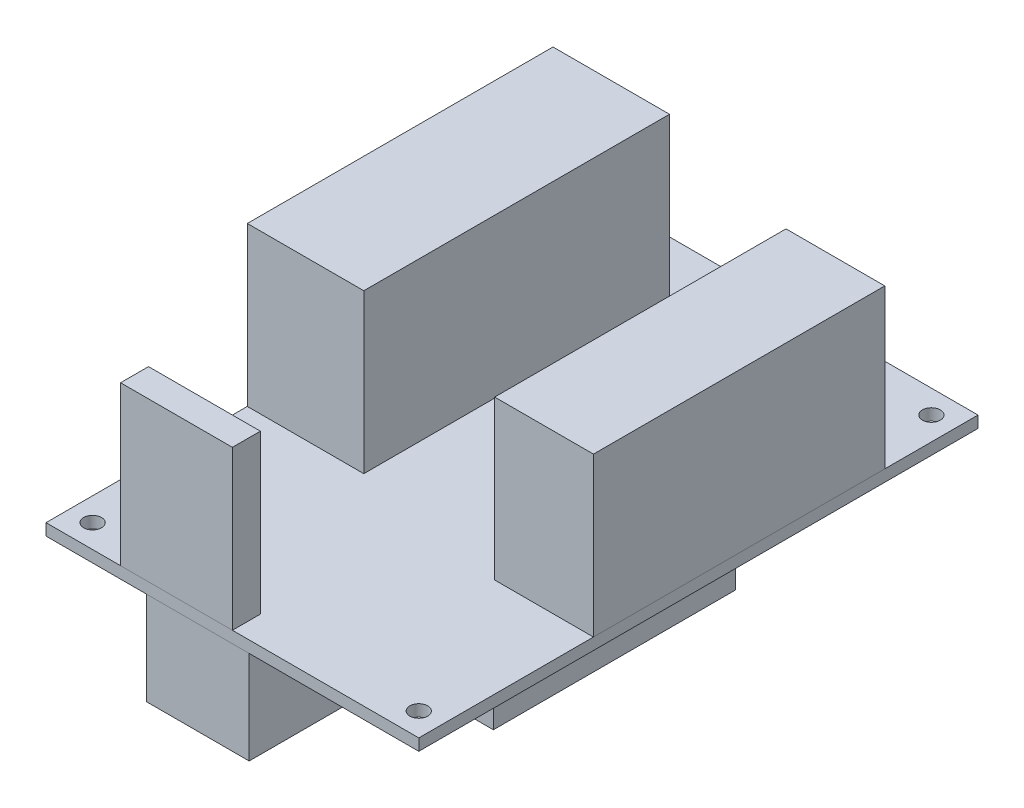
ISO-10303-21;
HEADER;
FILE_DESCRIPTION(('STEP AP214'),'2;1');
FILE_NAME('part.step','',(''),(''),'','','');
FILE_SCHEMA(('AUTOMOTIVE_DESIGN { 1 0 10303 214 1 1 1 1 }'));
ENDSEC;
DATA;
#1=APPLICATION_CONTEXT('core data for automotive mechanical design processes');
#2=APPLICATION_PROTOCOL_DEFINITION('international standard','automotive_design',2000,#1);
#3=PRODUCT_CONTEXT('',#1,'mechanical');
#4=PRODUCT('Part','Part','',(#3));
#5=PRODUCT_RELATED_PRODUCT_CATEGORY('part','',(#4));
#6=PRODUCT_DEFINITION_FORMATION('','',#4);
#7=PRODUCT_DEFINITION_CONTEXT('part definition',#1,'design');
#8=PRODUCT_DEFINITION('design','',#6,#7);
#9=PRODUCT_DEFINITION_SHAPE('','',#8);
#10=(LENGTH_UNIT() NAMED_UNIT(*) SI_UNIT(.MILLI.,.METRE.));
#11=(NAMED_UNIT(*) PLANE_ANGLE_UNIT() SI_UNIT($,.RADIAN.));
#12=(NAMED_UNIT(*) SI_UNIT($,.STERADIAN.) SOLID_ANGLE_UNIT());
#13=UNCERTAINTY_MEASURE_WITH_UNIT(LENGTH_MEASURE(1.E-05),#10,'distance_accuracy_value','');
#14=(GEOMETRIC_REPRESENTATION_CONTEXT(3) GLOBAL_UNCERTAINTY_ASSIGNED_CONTEXT((#13)) GLOBAL_UNIT_ASSIGNED_CONTEXT((#10,
#11,#12)) REPRESENTATION_CONTEXT('',''));
#15=CARTESIAN_POINT('',(0.,0.,0.));
#16=DIRECTION('',(0.,0.,1.));
#17=DIRECTION('',(1.,0.,0.));
#18=AXIS2_PLACEMENT_3D('',#15,#16,#17);
#19=CARTESIAN_POINT('',(2.54,-12.7,17.78));
#20=DIRECTION('',(1.,0.,0.));
#21=DIRECTION('',(0.,0.,-1.));
#22=AXIS2_PLACEMENT_3D('',#19,#20,#21);
#23=PLANE('',#22);
#24=DIRECTION('',(0.,0.,-1.));
#25=VECTOR('',#24,1.);
#26=CARTESIAN_POINT('',(2.54,0.,17.78));
#27=LINE('',#26,#25);
#28=CARTESIAN_POINT('',(2.54,0.,17.78));
#29=VERTEX_POINT('',#28);
#30=CARTESIAN_POINT('',(2.54000000000001,0.,-15.24));
#31=VERTEX_POINT('',#30);
#32=EDGE_CURVE('E109',#29,#31,#27,.T.);
#33=ORIENTED_EDGE('',*,*,#32,.T.);
#34=DIRECTION('',(0.,1.,0.));
#35=VECTOR('',#34,1.);
#36=CARTESIAN_POINT('',(2.54000000000001,-12.7,-15.24));
#37=LINE('',#36,#35);
#38=CARTESIAN_POINT('',(2.54000000000001,-12.7,-15.24));
#39=VERTEX_POINT('',#38);
#40=EDGE_CURVE('E12',#39,#31,#37,.T.);
#41=ORIENTED_EDGE('',*,*,#40,.F.);
#42=DIRECTION('',(0.,0.,-1.));
#43=VECTOR('',#42,1.);
#44=CARTESIAN_POINT('',(2.54,-12.7,17.78));
#45=LINE('',#44,#43);
#46=CARTESIAN_POINT('',(2.54,-12.7,17.78));
#47=VERTEX_POINT('',#46);
#48=EDGE_CURVE('E97',#47,#39,#45,.T.);
#49=ORIENTED_EDGE('',*,*,#48,.F.);
#50=DIRECTION('',(0.,1.,0.));
#51=VECTOR('',#50,1.);
#52=CARTESIAN_POINT('',(2.54,-12.7,17.78));
#53=LINE('',#52,#51);
#54=EDGE_CURVE('E105',#47,#29,#53,.T.);
#55=ORIENTED_EDGE('',*,*,#54,.T.);
#56=EDGE_LOOP('',(#33,#41,#49,#55));
#57=FACE_BOUND('',#56,.T.);
#58=ADVANCED_FACE('F46',(#57),#23,.F.);
#59=CARTESIAN_POINT('',(2.54000000000001,-12.7,-15.24));
#60=DIRECTION('',(0.,0.,1.));
#61=DIRECTION('',(1.,0.,0.));
#62=AXIS2_PLACEMENT_3D('',#59,#60,#61);
#63=PLANE('',#62);
#64=DIRECTION('',(1.,0.,0.));
#65=VECTOR('',#64,1.);
#66=CARTESIAN_POINT('',(2.54000000000001,0.,-15.24));
#67=LINE('',#66,#65);
#68=CARTESIAN_POINT('',(15.24,0.,-15.24));
#69=VERTEX_POINT('',#68);
#70=EDGE_CURVE('E101',#31,#69,#67,.T.);
#71=ORIENTED_EDGE('',*,*,#70,.T.);
#72=DIRECTION('',(0.,1.,0.));
#73=VECTOR('',#72,1.);
#74=CARTESIAN_POINT('',(15.24,-12.7,-15.24));
#75=LINE('',#74,#73);
#76=CARTESIAN_POINT('',(15.24,-12.7,-15.24));
#77=VERTEX_POINT('',#76);
#78=EDGE_CURVE('E54',#77,#69,#75,.T.);
#79=ORIENTED_EDGE('',*,*,#78,.F.);
#80=DIRECTION('',(1.,0.,0.));
#81=VECTOR('',#80,1.);
#82=CARTESIAN_POINT('',(2.54000000000001,-12.7,-15.24));
#83=LINE('',#82,#81);
#84=EDGE_CURVE('E92',#39,#77,#83,.T.);
#85=ORIENTED_EDGE('',*,*,#84,.F.);
#86=ORIENTED_EDGE('',*,*,#40,.T.);
#87=EDGE_LOOP('',(#71,#79,#85,#86));
#88=FACE_BOUND('',#87,.T.);
#89=ADVANCED_FACE('F100',(#88),#63,.F.);
#90=CARTESIAN_POINT('',(15.24,-12.7,17.78));
#91=DIRECTION('',(-1.,0.,0.));
#92=DIRECTION('',(0.,0.,1.));
#93=AXIS2_PLACEMENT_3D('',#90,#91,#92);
#94=PLANE('',#93);
#95=DIRECTION('',(0.,0.,1.));
#96=VECTOR('',#95,1.);
#97=CARTESIAN_POINT('',(15.24,0.,17.78));
#98=LINE('',#97,#96);
#99=CARTESIAN_POINT('',(15.24,0.,17.78));
#100=VERTEX_POINT('',#99);
#101=EDGE_CURVE('E79',#69,#100,#98,.T.);
#102=ORIENTED_EDGE('',*,*,#101,.T.);
#103=DIRECTION('',(0.,1.,0.));
#104=VECTOR('',#103,1.);
#105=CARTESIAN_POINT('',(15.24,-12.7,17.78));
#106=LINE('',#105,#104);
#107=CARTESIAN_POINT('',(15.24,-12.7,17.78));
#108=VERTEX_POINT('',#107);
#109=EDGE_CURVE('E102',#108,#100,#106,.T.);
#110=ORIENTED_EDGE('',*,*,#109,.F.);
#111=DIRECTION('',(0.,0.,1.));
#112=VECTOR('',#111,1.);
#113=CARTESIAN_POINT('',(15.24,-12.7,17.78));
#114=LINE('',#113,#112);
#115=EDGE_CURVE('E95',#77,#108,#114,.T.);
#116=ORIENTED_EDGE('',*,*,#115,.F.);
#117=ORIENTED_EDGE('',*,*,#78,.T.);
#118=EDGE_LOOP('',(#102,#110,#116,#117));
#119=FACE_BOUND('',#118,.T.);
#120=ADVANCED_FACE('F103',(#119),#94,.F.);
#121=CARTESIAN_POINT('',(2.54,-12.7,17.78));
#122=DIRECTION('',(0.,0.,-1.));
#123=DIRECTION('',(-1.,0.,0.));
#124=AXIS2_PLACEMENT_3D('',#121,#122,#123);
#125=PLANE('',#124);
#126=DIRECTION('',(-1.,0.,0.));
#127=VECTOR('',#126,1.);
#128=CARTESIAN_POINT('',(2.54,0.,17.78));
#129=LINE('',#128,#127);
#130=EDGE_CURVE('E85',#100,#29,#129,.T.);
#131=ORIENTED_EDGE('',*,*,#130,.T.);
#132=ORIENTED_EDGE('',*,*,#54,.F.);
#133=DIRECTION('',(-1.,0.,0.));
#134=VECTOR('',#133,1.);
#135=CARTESIAN_POINT('',(2.54,-12.7,17.78));
#136=LINE('',#135,#134);
#137=EDGE_CURVE('E62',#108,#47,#136,.T.);
#138=ORIENTED_EDGE('',*,*,#137,.F.);
#139=ORIENTED_EDGE('',*,*,#109,.T.);
#140=EDGE_LOOP('',(#131,#132,#138,#139));
#141=FACE_BOUND('',#140,.T.);
#142=ADVANCED_FACE('F116',(#141),#125,.F.);
#143=CARTESIAN_POINT('',(0.,-12.7,0.));
#144=DIRECTION('',(0.,-1.,0.));
#145=DIRECTION('',(0.,0.,-1.));
#146=AXIS2_PLACEMENT_3D('',#143,#144,#145);
#147=PLANE('',#146);
#148=ORIENTED_EDGE('',*,*,#48,.T.);
#149=ORIENTED_EDGE('',*,*,#84,.T.);
#150=ORIENTED_EDGE('',*,*,#115,.T.);
#151=ORIENTED_EDGE('',*,*,#137,.T.);
#152=EDGE_LOOP('',(#148,#149,#150,#151));
#153=FACE_BOUND('',#152,.T.);
#154=ADVANCED_FACE('F93',(#153),#147,.T.);
#155=CARTESIAN_POINT('',(0.,0.,0.));
#156=DIRECTION('',(0.,-1.,0.));
#157=DIRECTION('',(0.,0.,-1.));
#158=AXIS2_PLACEMENT_3D('',#155,#156,#157);
#159=PLANE('',#158);
#160=ORIENTED_EDGE('',*,*,#32,.F.);
#161=ORIENTED_EDGE('',*,*,#130,.F.);
#162=ORIENTED_EDGE('',*,*,#101,.F.);
#163=ORIENTED_EDGE('',*,*,#70,.F.);
#164=EDGE_LOOP('',(#160,#161,#162,#163));
#165=FACE_BOUND('',#164,.T.);
#166=ADVANCED_FACE('F119',(#165),#159,.F.);
#167=CLOSED_SHELL('',(#58,#89,#120,#142,#154,#166));
#168=MANIFOLD_SOLID_BREP('B2',#167);
#169=CARTESIAN_POINT('',(-11.684,-12.7,38.1));
#170=DIRECTION('',(1.,0.,0.));
#171=DIRECTION('',(0.,0.,-1.));
#172=AXIS2_PLACEMENT_3D('',#169,#170,#171);
#173=PLANE('',#172);
#174=DIRECTION('',(0.,0.,-1.));
#175=VECTOR('',#174,1.);
#176=CARTESIAN_POINT('',(-11.684,0.,38.1));
#177=LINE('',#176,#175);
#178=CARTESIAN_POINT('',(-11.684,0.,38.1));
#179=VERTEX_POINT('',#178);
#180=CARTESIAN_POINT('',(-11.684,0.,-22.098));
#181=VERTEX_POINT('',#180);
#182=EDGE_CURVE('E243',#179,#181,#177,.T.);
#183=ORIENTED_EDGE('',*,*,#182,.T.);
#184=DIRECTION('',(0.,1.,0.));
#185=VECTOR('',#184,1.);
#186=CARTESIAN_POINT('',(-11.684,-12.7,-22.098));
#187=LINE('',#186,#185);
#188=CARTESIAN_POINT('',(-11.684,-12.7,-22.098));
#189=VERTEX_POINT('',#188);
#190=EDGE_CURVE('E44',#189,#181,#187,.T.);
#191=ORIENTED_EDGE('',*,*,#190,.F.);
#192=DIRECTION('',(0.,0.,-1.));
#193=VECTOR('',#192,1.);
#194=CARTESIAN_POINT('',(-11.684,-12.7,38.1));
#195=LINE('',#194,#193);
#196=CARTESIAN_POINT('',(-11.684,-12.7,38.1));
#197=VERTEX_POINT('',#196);
#198=EDGE_CURVE('E231',#197,#189,#195,.T.);
#199=ORIENTED_EDGE('',*,*,#198,.F.);
#200=DIRECTION('',(0.,1.,0.));
#201=VECTOR('',#200,1.);
#202=CARTESIAN_POINT('',(-11.684,-12.7,38.1));
#203=LINE('',#202,#201);
#204=EDGE_CURVE('E239',#197,#179,#203,.T.);
#205=ORIENTED_EDGE('',*,*,#204,.T.);
#206=EDGE_LOOP('',(#183,#191,#199,#205));
#207=FACE_BOUND('',#206,.T.);
#208=ADVANCED_FACE('F180',(#207),#173,.F.);
#209=CARTESIAN_POINT('',(-11.684,-12.7,-22.098));
#210=DIRECTION('',(0.,0.,1.));
#211=DIRECTION('',(1.,0.,0.));
#212=AXIS2_PLACEMENT_3D('',#209,#210,#211);
#213=PLANE('',#212);
#214=DIRECTION('',(1.,0.,0.));
#215=VECTOR('',#214,1.);
#216=CARTESIAN_POINT('',(-11.684,0.,-22.098));
#217=LINE('',#216,#215);
#218=CARTESIAN_POINT('',(2.28600000000001,0.,-22.098));
#219=VERTEX_POINT('',#218);
#220=EDGE_CURVE('E235',#181,#219,#217,.T.);
#221=ORIENTED_EDGE('',*,*,#220,.T.);
#222=DIRECTION('',(0.,1.,0.));
#223=VECTOR('',#222,1.);
#224=CARTESIAN_POINT('',(2.28600000000001,-12.7,-22.098));
#225=LINE('',#224,#223);
#226=CARTESIAN_POINT('',(2.28600000000001,-12.7,-22.098));
#227=VERTEX_POINT('',#226);
#228=EDGE_CURVE('E188',#227,#219,#225,.T.);
#229=ORIENTED_EDGE('',*,*,#228,.F.);
#230=DIRECTION('',(1.,0.,0.));
#231=VECTOR('',#230,1.);
#232=CARTESIAN_POINT('',(-11.684,-12.7,-22.098));
#233=LINE('',#232,#231);
#234=EDGE_CURVE('E226',#189,#227,#233,.T.);
#235=ORIENTED_EDGE('',*,*,#234,.F.);
#236=ORIENTED_EDGE('',*,*,#190,.T.);
#237=EDGE_LOOP('',(#221,#229,#235,#236));
#238=FACE_BOUND('',#237,.T.);
#239=ADVANCED_FACE('F234',(#238),#213,.F.);
#240=CARTESIAN_POINT('',(2.286,-12.7,38.1));
#241=DIRECTION('',(-1.,0.,0.));
#242=DIRECTION('',(0.,0.,1.));
#243=AXIS2_PLACEMENT_3D('',#240,#241,#242);
#244=PLANE('',#243);
#245=DIRECTION('',(0.,0.,1.));
#246=VECTOR('',#245,1.);
#247=CARTESIAN_POINT('',(2.286,0.,38.1));
#248=LINE('',#247,#246);
#249=CARTESIAN_POINT('',(2.286,0.,38.1));
#250=VERTEX_POINT('',#249);
#251=EDGE_CURVE('E213',#219,#250,#248,.T.);
#252=ORIENTED_EDGE('',*,*,#251,.T.);
#253=DIRECTION('',(0.,1.,0.));
#254=VECTOR('',#253,1.);
#255=CARTESIAN_POINT('',(2.286,-12.7,38.1));
#256=LINE('',#255,#254);
#257=CARTESIAN_POINT('',(2.286,-12.7,38.1));
#258=VERTEX_POINT('',#257);
#259=EDGE_CURVE('E236',#258,#250,#256,.T.);
#260=ORIENTED_EDGE('',*,*,#259,.F.);
#261=DIRECTION('',(0.,0.,1.));
#262=VECTOR('',#261,1.);
#263=CARTESIAN_POINT('',(2.286,-12.7,38.1));
#264=LINE('',#263,#262);
#265=EDGE_CURVE('E229',#227,#258,#264,.T.);
#266=ORIENTED_EDGE('',*,*,#265,.F.);
#267=ORIENTED_EDGE('',*,*,#228,.T.);
#268=EDGE_LOOP('',(#252,#260,#266,#267));
#269=FACE_BOUND('',#268,.T.);
#270=ADVANCED_FACE('F237',(#269),#244,.F.);
#271=CARTESIAN_POINT('',(-11.684,-12.7,38.1));
#272=DIRECTION('',(0.,0.,-1.));
#273=DIRECTION('',(-1.,0.,0.));
#274=AXIS2_PLACEMENT_3D('',#271,#272,#273);
#275=PLANE('',#274);
#276=DIRECTION('',(-1.,0.,0.));
#277=VECTOR('',#276,1.);
#278=CARTESIAN_POINT('',(-11.684,0.,38.1));
#279=LINE('',#278,#277);
#280=EDGE_CURVE('E219',#250,#179,#279,.T.);
#281=ORIENTED_EDGE('',*,*,#280,.T.);
#282=ORIENTED_EDGE('',*,*,#204,.F.);
#283=DIRECTION('',(-1.,0.,0.));
#284=VECTOR('',#283,1.);
#285=CARTESIAN_POINT('',(-11.684,-12.7,38.1));
#286=LINE('',#285,#284);
#287=EDGE_CURVE('E196',#258,#197,#286,.T.);
#288=ORIENTED_EDGE('',*,*,#287,.F.);
#289=ORIENTED_EDGE('',*,*,#259,.T.);
#290=EDGE_LOOP('',(#281,#282,#288,#289));
#291=FACE_BOUND('',#290,.T.);
#292=ADVANCED_FACE('F250',(#291),#275,.F.);
#293=CARTESIAN_POINT('',(0.,-12.7,0.));
#294=DIRECTION('',(0.,-1.,0.));
#295=DIRECTION('',(0.,0.,-1.));
#296=AXIS2_PLACEMENT_3D('',#293,#294,#295);
#297=PLANE('',#296);
#298=ORIENTED_EDGE('',*,*,#198,.T.);
#299=ORIENTED_EDGE('',*,*,#234,.T.);
#300=ORIENTED_EDGE('',*,*,#265,.T.);
#301=ORIENTED_EDGE('',*,*,#287,.T.);
#302=EDGE_LOOP('',(#298,#299,#300,#301));
#303=FACE_BOUND('',#302,.T.);
#304=ADVANCED_FACE('F227',(#303),#297,.T.);
#305=CARTESIAN_POINT('',(0.,0.,0.));
#306=DIRECTION('',(0.,-1.,0.));
#307=DIRECTION('',(0.,0.,-1.));
#308=AXIS2_PLACEMENT_3D('',#305,#306,#307);
#309=PLANE('',#308);
#310=ORIENTED_EDGE('',*,*,#182,.F.);
#311=ORIENTED_EDGE('',*,*,#280,.F.);
#312=ORIENTED_EDGE('',*,*,#251,.F.);
#313=ORIENTED_EDGE('',*,*,#220,.F.);
#314=EDGE_LOOP('',(#310,#311,#312,#313));
#315=FACE_BOUND('',#314,.T.);
#316=ADVANCED_FACE('F253',(#315),#309,.F.);
#317=CLOSED_SHELL('',(#208,#239,#270,#292,#304,#316));
#318=MANIFOLD_SOLID_BREP('B6',#317);
#319=CARTESIAN_POINT('',(-15.24,23.1775,34.29));
#320=DIRECTION('',(1.,0.,0.));
#321=DIRECTION('',(0.,0.,-1.));
#322=AXIS2_PLACEMENT_3D('',#319,#320,#321);
#323=PLANE('',#322);
#324=DIRECTION('',(0.,0.,1.));
#325=VECTOR('',#324,1.);
#326=CARTESIAN_POINT('',(-15.24,1.5875,34.29));
#327=LINE('',#326,#325);
#328=CARTESIAN_POINT('',(-15.24,1.5875,34.29));
#329=VERTEX_POINT('',#328);
#330=CARTESIAN_POINT('',(-15.24,1.5875,38.1));
#331=VERTEX_POINT('',#330);
#332=EDGE_CURVE('E377',#329,#331,#327,.T.);
#333=ORIENTED_EDGE('',*,*,#332,.T.);
#334=DIRECTION('',(0.,-1.,0.));
#335=VECTOR('',#334,1.);
#336=CARTESIAN_POINT('',(-15.24,23.1775,38.1));
#337=LINE('',#336,#335);
#338=CARTESIAN_POINT('',(-15.24,23.1775,38.1));
#339=VERTEX_POINT('',#338);
#340=EDGE_CURVE('E178',#339,#331,#337,.T.);
#341=ORIENTED_EDGE('',*,*,#340,.F.);
#342=DIRECTION('',(0.,0.,1.));
#343=VECTOR('',#342,1.);
#344=CARTESIAN_POINT('',(-15.24,23.1775,34.29));
#345=LINE('',#344,#343);
#346=CARTESIAN_POINT('',(-15.24,23.1775,34.29));
#347=VERTEX_POINT('',#346);
#348=EDGE_CURVE('E365',#347,#339,#345,.T.);
#349=ORIENTED_EDGE('',*,*,#348,.F.);
#350=DIRECTION('',(0.,-1.,0.));
#351=VECTOR('',#350,1.);
#352=CARTESIAN_POINT('',(-15.24,23.1775,34.29));
#353=LINE('',#352,#351);
#354=EDGE_CURVE('E373',#347,#329,#353,.T.);
#355=ORIENTED_EDGE('',*,*,#354,.T.);
#356=EDGE_LOOP('',(#333,#341,#349,#355));
#357=FACE_BOUND('',#356,.T.);
#358=ADVANCED_FACE('F314',(#357),#323,.F.);
#359=CARTESIAN_POINT('',(-15.24,23.1775,38.1));
#360=DIRECTION('',(0.,0.,-1.));
#361=DIRECTION('',(-1.,0.,0.));
#362=AXIS2_PLACEMENT_3D('',#359,#360,#361);
#363=PLANE('',#362);
#364=DIRECTION('',(1.,0.,0.));
#365=VECTOR('',#364,1.);
#366=CARTESIAN_POINT('',(-15.24,1.5875,38.1));
#367=LINE('',#366,#365);
#368=CARTESIAN_POINT('',(0.,1.5875,38.1));
#369=VERTEX_POINT('',#368);
#370=EDGE_CURVE('E369',#331,#369,#367,.T.);
#371=ORIENTED_EDGE('',*,*,#370,.T.);
#372=DIRECTION('',(0.,-1.,0.));
#373=VECTOR('',#372,1.);
#374=CARTESIAN_POINT('',(0.,23.1775,38.1));
#375=LINE('',#374,#373);
#376=CARTESIAN_POINT('',(0.,23.1775,38.1));
#377=VERTEX_POINT('',#376);
#378=EDGE_CURVE('E322',#377,#369,#375,.T.);
#379=ORIENTED_EDGE('',*,*,#378,.F.);
#380=DIRECTION('',(1.,0.,0.));
#381=VECTOR('',#380,1.);
#382=CARTESIAN_POINT('',(-15.24,23.1775,38.1));
#383=LINE('',#382,#381);
#384=EDGE_CURVE('E360',#339,#377,#383,.T.);
#385=ORIENTED_EDGE('',*,*,#384,.F.);
#386=ORIENTED_EDGE('',*,*,#340,.T.);
#387=EDGE_LOOP('',(#371,#379,#385,#386));
#388=FACE_BOUND('',#387,.T.);
#389=ADVANCED_FACE('F368',(#388),#363,.F.);
#390=CARTESIAN_POINT('',(0.,23.1775,34.29));
#391=DIRECTION('',(-1.,0.,0.));
#392=DIRECTION('',(0.,0.,1.));
#393=AXIS2_PLACEMENT_3D('',#390,#391,#392);
#394=PLANE('',#393);
#395=DIRECTION('',(0.,0.,-1.));
#396=VECTOR('',#395,1.);
#397=CARTESIAN_POINT('',(0.,1.5875,34.29));
#398=LINE('',#397,#396);
#399=CARTESIAN_POINT('',(0.,1.5875,34.29));
#400=VERTEX_POINT('',#399);
#401=EDGE_CURVE('E347',#369,#400,#398,.T.);
#402=ORIENTED_EDGE('',*,*,#401,.T.);
#403=DIRECTION('',(0.,-1.,0.));
#404=VECTOR('',#403,1.);
#405=CARTESIAN_POINT('',(0.,23.1775,34.29));
#406=LINE('',#405,#404);
#407=CARTESIAN_POINT('',(0.,23.1775,34.29));
#408=VERTEX_POINT('',#407);
#409=EDGE_CURVE('E370',#408,#400,#406,.T.);
#410=ORIENTED_EDGE('',*,*,#409,.F.);
#411=DIRECTION('',(0.,0.,-1.));
#412=VECTOR('',#411,1.);
#413=CARTESIAN_POINT('',(0.,23.1775,34.29));
#414=LINE('',#413,#412);
#415=EDGE_CURVE('E363',#377,#408,#414,.T.);
#416=ORIENTED_EDGE('',*,*,#415,.F.);
#417=ORIENTED_EDGE('',*,*,#378,.T.);
#418=EDGE_LOOP('',(#402,#410,#416,#417));
#419=FACE_BOUND('',#418,.T.);
#420=ADVANCED_FACE('F371',(#419),#394,.F.);
#421=CARTESIAN_POINT('',(-15.24,23.1775,34.29));
#422=DIRECTION('',(0.,0.,1.));
#423=DIRECTION('',(1.,0.,0.));
#424=AXIS2_PLACEMENT_3D('',#421,#422,#423);
#425=PLANE('',#424);
#426=DIRECTION('',(-1.,0.,0.));
#427=VECTOR('',#426,1.);
#428=CARTESIAN_POINT('',(-15.24,1.5875,34.29));
#429=LINE('',#428,#427);
#430=EDGE_CURVE('E353',#400,#329,#429,.T.);
#431=ORIENTED_EDGE('',*,*,#430,.T.);
#432=ORIENTED_EDGE('',*,*,#354,.F.);
#433=DIRECTION('',(-1.,0.,0.));
#434=VECTOR('',#433,1.);
#435=CARTESIAN_POINT('',(-15.24,23.1775,34.29));
#436=LINE('',#435,#434);
#437=EDGE_CURVE('E330',#408,#347,#436,.T.);
#438=ORIENTED_EDGE('',*,*,#437,.F.);
#439=ORIENTED_EDGE('',*,*,#409,.T.);
#440=EDGE_LOOP('',(#431,#432,#438,#439));
#441=FACE_BOUND('',#440,.T.);
#442=ADVANCED_FACE('F384',(#441),#425,.F.);
#443=CARTESIAN_POINT('',(0.,23.1775,0.));
#444=DIRECTION('',(0.,1.,0.));
#445=DIRECTION('',(0.,0.,1.));
#446=AXIS2_PLACEMENT_3D('',#443,#444,#445);
#447=PLANE('',#446);
#448=ORIENTED_EDGE('',*,*,#348,.T.);
#449=ORIENTED_EDGE('',*,*,#384,.T.);
#450=ORIENTED_EDGE('',*,*,#415,.T.);
#451=ORIENTED_EDGE('',*,*,#437,.T.);
#452=EDGE_LOOP('',(#448,#449,#450,#451));
#453=FACE_BOUND('',#452,.T.);
#454=ADVANCED_FACE('F361',(#453),#447,.T.);
#455=CARTESIAN_POINT('',(0.,1.5875,0.));
#456=DIRECTION('',(0.,1.,0.));
#457=DIRECTION('',(0.,0.,1.));
#458=AXIS2_PLACEMENT_3D('',#455,#456,#457);
#459=PLANE('',#458);
#460=ORIENTED_EDGE('',*,*,#332,.F.);
#461=ORIENTED_EDGE('',*,*,#430,.F.);
#462=ORIENTED_EDGE('',*,*,#401,.F.);
#463=ORIENTED_EDGE('',*,*,#370,.F.);
#464=EDGE_LOOP('',(#460,#461,#462,#463));
#465=FACE_BOUND('',#464,.T.);
#466=ADVANCED_FACE('F387',(#465),#459,.F.);
#467=CLOSED_SHELL('',(#358,#389,#420,#442,#454,#466));
#468=MANIFOLD_SOLID_BREP('B38',#467);
#469=CARTESIAN_POINT('',(11.938,23.1775,-25.4));
#470=DIRECTION('',(1.,0.,0.));
#471=DIRECTION('',(0.,0.,-1.));
#472=AXIS2_PLACEMENT_3D('',#469,#470,#471);
#473=PLANE('',#472);
#474=DIRECTION('',(0.,0.,1.));
#475=VECTOR('',#474,1.);
#476=CARTESIAN_POINT('',(11.938,1.5875,-25.4));
#477=LINE('',#476,#475);
#478=CARTESIAN_POINT('',(11.938,1.5875,-25.4));
#479=VERTEX_POINT('',#478);
#480=CARTESIAN_POINT('',(11.938,1.5875,14.3002));
#481=VERTEX_POINT('',#480);
#482=EDGE_CURVE('E511',#479,#481,#477,.T.);
#483=ORIENTED_EDGE('',*,*,#482,.T.);
#484=DIRECTION('',(0.,-1.,0.));
#485=VECTOR('',#484,1.);
#486=CARTESIAN_POINT('',(11.938,23.1775,14.3002));
#487=LINE('',#486,#485);
#488=CARTESIAN_POINT('',(11.938,23.1775,14.3002));
#489=VERTEX_POINT('',#488);
#490=EDGE_CURVE('E312',#489,#481,#487,.T.);
#491=ORIENTED_EDGE('',*,*,#490,.F.);
#492=DIRECTION('',(0.,0.,1.));
#493=VECTOR('',#492,1.);
#494=CARTESIAN_POINT('',(11.938,23.1775,-25.4));
#495=LINE('',#494,#493);
#496=CARTESIAN_POINT('',(11.938,23.1775,-25.4));
#497=VERTEX_POINT('',#496);
#498=EDGE_CURVE('E499',#497,#489,#495,.T.);
#499=ORIENTED_EDGE('',*,*,#498,.F.);
#500=DIRECTION('',(0.,-1.,0.));
#501=VECTOR('',#500,1.);
#502=CARTESIAN_POINT('',(11.938,23.1775,-25.4));
#503=LINE('',#502,#501);
#504=EDGE_CURVE('E507',#497,#479,#503,.T.);
#505=ORIENTED_EDGE('',*,*,#504,.T.);
#506=EDGE_LOOP('',(#483,#491,#499,#505));
#507=FACE_BOUND('',#506,.T.);
#508=ADVANCED_FACE('F448',(#507),#473,.F.);
#509=CARTESIAN_POINT('',(11.938,23.1775,14.3002));
#510=DIRECTION('',(0.,0.,-1.));
#511=DIRECTION('',(-1.,0.,0.));
#512=AXIS2_PLACEMENT_3D('',#509,#510,#511);
#513=PLANE('',#512);
#514=DIRECTION('',(1.,0.,0.));
#515=VECTOR('',#514,1.);
#516=CARTESIAN_POINT('',(11.938,1.5875,14.3002));
#517=LINE('',#516,#515);
#518=CARTESIAN_POINT('',(25.4,1.5875,14.3002));
#519=VERTEX_POINT('',#518);
#520=EDGE_CURVE('E503',#481,#519,#517,.T.);
#521=ORIENTED_EDGE('',*,*,#520,.T.);
#522=DIRECTION('',(0.,-1.,0.));
#523=VECTOR('',#522,1.);
#524=CARTESIAN_POINT('',(25.4,23.1775,14.3002));
#525=LINE('',#524,#523);
#526=CARTESIAN_POINT('',(25.4,23.1775,14.3002));
#527=VERTEX_POINT('',#526);
#528=EDGE_CURVE('E456',#527,#519,#525,.T.);
#529=ORIENTED_EDGE('',*,*,#528,.F.);
#530=DIRECTION('',(1.,0.,0.));
#531=VECTOR('',#530,1.);
#532=CARTESIAN_POINT('',(11.938,23.1775,14.3002));
#533=LINE('',#532,#531);
#534=EDGE_CURVE('E494',#489,#527,#533,.T.);
#535=ORIENTED_EDGE('',*,*,#534,.F.);
#536=ORIENTED_EDGE('',*,*,#490,.T.);
#537=EDGE_LOOP('',(#521,#529,#535,#536));
#538=FACE_BOUND('',#537,.T.);
#539=ADVANCED_FACE('F502',(#538),#513,.F.);
#540=CARTESIAN_POINT('',(25.4,23.1775,-25.4));
#541=DIRECTION('',(-1.,0.,0.));
#542=DIRECTION('',(0.,0.,1.));
#543=AXIS2_PLACEMENT_3D('',#540,#541,#542);
#544=PLANE('',#543);
#545=DIRECTION('',(0.,0.,-1.));
#546=VECTOR('',#545,1.);
#547=CARTESIAN_POINT('',(25.4,1.5875,-25.4));
#548=LINE('',#547,#546);
#549=CARTESIAN_POINT('',(25.4,1.5875,-25.4));
#550=VERTEX_POINT('',#549);
#551=EDGE_CURVE('E481',#519,#550,#548,.T.);
#552=ORIENTED_EDGE('',*,*,#551,.T.);
#553=DIRECTION('',(0.,-1.,0.));
#554=VECTOR('',#553,1.);
#555=CARTESIAN_POINT('',(25.4,23.1775,-25.4));
#556=LINE('',#555,#554);
#557=CARTESIAN_POINT('',(25.4,23.1775,-25.4));
#558=VERTEX_POINT('',#557);
#559=EDGE_CURVE('E504',#558,#550,#556,.T.);
#560=ORIENTED_EDGE('',*,*,#559,.F.);
#561=DIRECTION('',(0.,0.,-1.));
#562=VECTOR('',#561,1.);
#563=CARTESIAN_POINT('',(25.4,23.1775,-25.4));
#564=LINE('',#563,#562);
#565=EDGE_CURVE('E497',#527,#558,#564,.T.);
#566=ORIENTED_EDGE('',*,*,#565,.F.);
#567=ORIENTED_EDGE('',*,*,#528,.T.);
#568=EDGE_LOOP('',(#552,#560,#566,#567));
#569=FACE_BOUND('',#568,.T.);
#570=ADVANCED_FACE('F505',(#569),#544,.F.);
#571=CARTESIAN_POINT('',(11.938,23.1775,-25.4));
#572=DIRECTION('',(0.,0.,1.));
#573=DIRECTION('',(1.,0.,0.));
#574=AXIS2_PLACEMENT_3D('',#571,#572,#573);
#575=PLANE('',#574);
#576=DIRECTION('',(-1.,0.,0.));
#577=VECTOR('',#576,1.);
#578=CARTESIAN_POINT('',(11.938,1.5875,-25.4));
#579=LINE('',#578,#577);
#580=EDGE_CURVE('E487',#550,#479,#579,.T.);
#581=ORIENTED_EDGE('',*,*,#580,.T.);
#582=ORIENTED_EDGE('',*,*,#504,.F.);
#583=DIRECTION('',(-1.,0.,0.));
#584=VECTOR('',#583,1.);
#585=CARTESIAN_POINT('',(11.938,23.1775,-25.4));
#586=LINE('',#585,#584);
#587=EDGE_CURVE('E464',#558,#497,#586,.T.);
#588=ORIENTED_EDGE('',*,*,#587,.F.);
#589=ORIENTED_EDGE('',*,*,#559,.T.);
#590=EDGE_LOOP('',(#581,#582,#588,#589));
#591=FACE_BOUND('',#590,.T.);
#592=ADVANCED_FACE('F518',(#591),#575,.F.);
#593=CARTESIAN_POINT('',(0.,23.1775,0.));
#594=DIRECTION('',(0.,1.,0.));
#595=DIRECTION('',(0.,0.,1.));
#596=AXIS2_PLACEMENT_3D('',#593,#594,#595);
#597=PLANE('',#596);
#598=ORIENTED_EDGE('',*,*,#498,.T.);
#599=ORIENTED_EDGE('',*,*,#534,.T.);
#600=ORIENTED_EDGE('',*,*,#565,.T.);
#601=ORIENTED_EDGE('',*,*,#587,.T.);
#602=EDGE_LOOP('',(#598,#599,#600,#601));
#603=FACE_BOUND('',#602,.T.);
#604=ADVANCED_FACE('F495',(#603),#597,.T.);
#605=CARTESIAN_POINT('',(0.,1.5875,0.));
#606=DIRECTION('',(0.,1.,0.));
#607=DIRECTION('',(0.,0.,1.));
#608=AXIS2_PLACEMENT_3D('',#605,#606,#607);
#609=PLANE('',#608);
#610=ORIENTED_EDGE('',*,*,#482,.F.);
#611=ORIENTED_EDGE('',*,*,#580,.F.);
#612=ORIENTED_EDGE('',*,*,#551,.F.);
#613=ORIENTED_EDGE('',*,*,#520,.F.);
#614=EDGE_LOOP('',(#610,#611,#612,#613));
#615=FACE_BOUND('',#614,.T.);
#616=ADVANCED_FACE('F521',(#615),#609,.F.);
#617=CLOSED_SHELL('',(#508,#539,#570,#592,#604,#616));
#618=MANIFOLD_SOLID_BREP('B172',#617);
#619=CARTESIAN_POINT('',(-25.4,23.1775,-30.988));
#620=DIRECTION('',(1.,0.,0.));
#621=DIRECTION('',(0.,0.,-1.));
#622=AXIS2_PLACEMENT_3D('',#619,#620,#621);
#623=PLANE('',#622);
#624=DIRECTION('',(0.,0.,1.));
#625=VECTOR('',#624,1.);
#626=CARTESIAN_POINT('',(-25.4,1.5875,-30.988));
#627=LINE('',#626,#625);
#628=CARTESIAN_POINT('',(-25.4,1.5875,-30.988));
#629=VERTEX_POINT('',#628);
#630=CARTESIAN_POINT('',(-25.4,1.5875,10.668));
#631=VERTEX_POINT('',#630);
#632=EDGE_CURVE('E644',#629,#631,#627,.T.);
#633=ORIENTED_EDGE('',*,*,#632,.T.);
#634=DIRECTION('',(0.,-1.,0.));
#635=VECTOR('',#634,1.);
#636=CARTESIAN_POINT('',(-25.4,23.1775,10.668));
#637=LINE('',#636,#635);
#638=CARTESIAN_POINT('',(-25.4,23.1775,10.668));
#639=VERTEX_POINT('',#638);
#640=EDGE_CURVE('E446',#639,#631,#637,.T.);
#641=ORIENTED_EDGE('',*,*,#640,.F.);
#642=DIRECTION('',(0.,0.,1.));
#643=VECTOR('',#642,1.);
#644=CARTESIAN_POINT('',(-25.4,23.1775,-30.988));
#645=LINE('',#644,#643);
#646=CARTESIAN_POINT('',(-25.4,23.1775,-30.988));
#647=VERTEX_POINT('',#646);
#648=EDGE_CURVE('E632',#647,#639,#645,.T.);
#649=ORIENTED_EDGE('',*,*,#648,.F.);
#650=DIRECTION('',(0.,-1.,0.));
#651=VECTOR('',#650,1.);
#652=CARTESIAN_POINT('',(-25.4,23.1775,-30.988));
#653=LINE('',#652,#651);
#654=EDGE_CURVE('E640',#647,#629,#653,.T.);
#655=ORIENTED_EDGE('',*,*,#654,.T.);
#656=EDGE_LOOP('',(#633,#641,#649,#655));
#657=FACE_BOUND('',#656,.T.);
#658=ADVANCED_FACE('F581',(#657),#623,.F.);
#659=CARTESIAN_POINT('',(-25.4,23.1775,10.668));
#660=DIRECTION('',(0.,0.,-1.));
#661=DIRECTION('',(-1.,0.,0.));
#662=AXIS2_PLACEMENT_3D('',#659,#660,#661);
#663=PLANE('',#662);
#664=DIRECTION('',(1.,0.,0.));
#665=VECTOR('',#664,1.);
#666=CARTESIAN_POINT('',(-25.4,1.5875,10.668));
#667=LINE('',#666,#665);
#668=CARTESIAN_POINT('',(-9.525,1.5875,10.668));
#669=VERTEX_POINT('',#668);
#670=EDGE_CURVE('E636',#631,#669,#667,.T.);
#671=ORIENTED_EDGE('',*,*,#670,.T.);
#672=DIRECTION('',(0.,-1.,0.));
#673=VECTOR('',#672,1.);
#674=CARTESIAN_POINT('',(-9.525,23.1775,10.668));
#675=LINE('',#674,#673);
#676=CARTESIAN_POINT('',(-9.525,23.1775,10.668));
#677=VERTEX_POINT('',#676);
#678=EDGE_CURVE('E589',#677,#669,#675,.T.);
#679=ORIENTED_EDGE('',*,*,#678,.F.);
#680=DIRECTION('',(1.,0.,0.));
#681=VECTOR('',#680,1.);
#682=CARTESIAN_POINT('',(-25.4,23.1775,10.668));
#683=LINE('',#682,#681);
#684=EDGE_CURVE('E627',#639,#677,#683,.T.);
#685=ORIENTED_EDGE('',*,*,#684,.F.);
#686=ORIENTED_EDGE('',*,*,#640,.T.);
#687=EDGE_LOOP('',(#671,#679,#685,#686));
#688=FACE_BOUND('',#687,.T.);
#689=ADVANCED_FACE('F635',(#688),#663,.F.);
#690=CARTESIAN_POINT('',(-9.525,23.1775,-30.988));
#691=DIRECTION('',(-1.,0.,0.));
#692=DIRECTION('',(0.,0.,1.));
#693=AXIS2_PLACEMENT_3D('',#690,#691,#692);
#694=PLANE('',#693);
#695=DIRECTION('',(0.,0.,-1.));
#696=VECTOR('',#695,1.);
#697=CARTESIAN_POINT('',(-9.525,1.5875,-30.988));
#698=LINE('',#697,#696);
#699=CARTESIAN_POINT('',(-9.525,1.5875,-30.988));
#700=VERTEX_POINT('',#699);
#701=EDGE_CURVE('E614',#669,#700,#698,.T.);
#702=ORIENTED_EDGE('',*,*,#701,.T.);
#703=DIRECTION('',(0.,-1.,0.));
#704=VECTOR('',#703,1.);
#705=CARTESIAN_POINT('',(-9.525,23.1775,-30.988));
#706=LINE('',#705,#704);
#707=CARTESIAN_POINT('',(-9.525,23.1775,-30.988));
#708=VERTEX_POINT('',#707);
#709=EDGE_CURVE('E637',#708,#700,#706,.T.);
#710=ORIENTED_EDGE('',*,*,#709,.F.);
#711=DIRECTION('',(0.,0.,-1.));
#712=VECTOR('',#711,1.);
#713=CARTESIAN_POINT('',(-9.525,23.1775,-30.988));
#714=LINE('',#713,#712);
#715=EDGE_CURVE('E630',#677,#708,#714,.T.);
#716=ORIENTED_EDGE('',*,*,#715,.F.);
#717=ORIENTED_EDGE('',*,*,#678,.T.);
#718=EDGE_LOOP('',(#702,#710,#716,#717));
#719=FACE_BOUND('',#718,.T.);
#720=ADVANCED_FACE('F638',(#719),#694,.F.);
#721=CARTESIAN_POINT('',(-25.4,23.1775,-30.988));
#722=DIRECTION('',(0.,0.,1.));
#723=DIRECTION('',(1.,0.,0.));
#724=AXIS2_PLACEMENT_3D('',#721,#722,#723);
#725=PLANE('',#724);
#726=DIRECTION('',(-1.,0.,0.));
#727=VECTOR('',#726,1.);
#728=CARTESIAN_POINT('',(-25.4,1.5875,-30.988));
#729=LINE('',#728,#727);
#730=EDGE_CURVE('E620',#700,#629,#729,.T.);
#731=ORIENTED_EDGE('',*,*,#730,.T.);
#732=ORIENTED_EDGE('',*,*,#654,.F.);
#733=DIRECTION('',(-1.,0.,0.));
#734=VECTOR('',#733,1.);
#735=CARTESIAN_POINT('',(-25.4,23.1775,-30.988));
#736=LINE('',#735,#734);
#737=EDGE_CURVE('E597',#708,#647,#736,.T.);
#738=ORIENTED_EDGE('',*,*,#737,.F.);
#739=ORIENTED_EDGE('',*,*,#709,.T.);
#740=EDGE_LOOP('',(#731,#732,#738,#739));
#741=FACE_BOUND('',#740,.T.);
#742=ADVANCED_FACE('F651',(#741),#725,.F.);
#743=CARTESIAN_POINT('',(0.,23.1775,0.));
#744=DIRECTION('',(0.,1.,0.));
#745=DIRECTION('',(0.,0.,1.));
#746=AXIS2_PLACEMENT_3D('',#743,#744,#745);
#747=PLANE('',#746);
#748=ORIENTED_EDGE('',*,*,#648,.T.);
#749=ORIENTED_EDGE('',*,*,#684,.T.);
#750=ORIENTED_EDGE('',*,*,#715,.T.);
#751=ORIENTED_EDGE('',*,*,#737,.T.);
#752=EDGE_LOOP('',(#748,#749,#750,#751));
#753=FACE_BOUND('',#752,.T.);
#754=ADVANCED_FACE('F628',(#753),#747,.T.);
#755=CARTESIAN_POINT('',(0.,1.5875,0.));
#756=DIRECTION('',(0.,1.,0.));
#757=DIRECTION('',(0.,0.,1.));
#758=AXIS2_PLACEMENT_3D('',#755,#756,#757);
#759=PLANE('',#758);
#760=ORIENTED_EDGE('',*,*,#632,.F.);
#761=ORIENTED_EDGE('',*,*,#730,.F.);
#762=ORIENTED_EDGE('',*,*,#701,.F.);
#763=ORIENTED_EDGE('',*,*,#670,.F.);
#764=EDGE_LOOP('',(#760,#761,#762,#763));
#765=FACE_BOUND('',#764,.T.);
#766=ADVANCED_FACE('F654',(#765),#759,.F.);
#767=CLOSED_SHELL('',(#658,#689,#720,#742,#754,#766));
#768=MANIFOLD_SOLID_BREP('B306',#767);
#769=CARTESIAN_POINT('',(0.,1.5875,0.));
#770=DIRECTION('',(0.,1.,0.));
#771=DIRECTION('',(0.,0.,1.));
#772=AXIS2_PLACEMENT_3D('',#769,#770,#771);
#773=PLANE('',#772);
#774=CARTESIAN_POINT('',(-22.225,1.5875,34.925));
#775=DIRECTION('',(0.,1.,0.));
#776=DIRECTION('',(0.,0.,1.));
#777=AXIS2_PLACEMENT_3D('',#774,#775,#776);
#778=CIRCLE('',#777,1.2192);
#779=CARTESIAN_POINT('',(-22.225,1.5875,36.1442));
#780=VERTEX_POINT('',#779);
#781=EDGE_CURVE('E793',#780,#780,#778,.T.);
#782=ORIENTED_EDGE('',*,*,#781,.F.);
#783=EDGE_LOOP('',(#782));
#784=FACE_BOUND('',#783,.T.);
#785=CARTESIAN_POINT('',(-22.225,1.5875,-34.925));
#786=DIRECTION('',(0.,1.,0.));
#787=DIRECTION('',(0.,0.,1.));
#788=AXIS2_PLACEMENT_3D('',#785,#786,#787);
#789=CIRCLE('',#788,1.2192);
#790=CARTESIAN_POINT('',(-22.225,1.5875,-33.7058));
#791=VERTEX_POINT('',#790);
#792=EDGE_CURVE('E772',#791,#791,#789,.T.);
#793=ORIENTED_EDGE('',*,*,#792,.F.);
#794=EDGE_LOOP('',(#793));
#795=FACE_BOUND('',#794,.T.);
#796=DIRECTION('',(0.,0.,1.));
#797=VECTOR('',#796,1.);
#798=CARTESIAN_POINT('',(-25.4,1.5875,-38.1));
#799=LINE('',#798,#797);
#800=CARTESIAN_POINT('',(-25.4,1.5875,-38.1));
#801=VERTEX_POINT('',#800);
#802=CARTESIAN_POINT('',(-25.4,1.5875,38.1));
#803=VERTEX_POINT('',#802);
#804=EDGE_CURVE('E757',#801,#803,#799,.T.);
#805=ORIENTED_EDGE('',*,*,#804,.T.);
#806=DIRECTION('',(1.,0.,0.));
#807=VECTOR('',#806,1.);
#808=CARTESIAN_POINT('',(-25.4,1.5875,38.1));
#809=LINE('',#808,#807);
#810=CARTESIAN_POINT('',(25.4,1.5875,38.1));
#811=VERTEX_POINT('',#810);
#812=EDGE_CURVE('E752',#803,#811,#809,.T.);
#813=ORIENTED_EDGE('',*,*,#812,.T.);
#814=DIRECTION('',(0.,0.,-1.));
#815=VECTOR('',#814,1.);
#816=CARTESIAN_POINT('',(25.4,1.5875,-38.1));
#817=LINE('',#816,#815);
#818=CARTESIAN_POINT('',(25.4,1.5875,-38.1));
#819=VERTEX_POINT('',#818);
#820=EDGE_CURVE('E755',#811,#819,#817,.T.);
#821=ORIENTED_EDGE('',*,*,#820,.T.);
#822=DIRECTION('',(-1.,0.,0.));
#823=VECTOR('',#822,1.);
#824=CARTESIAN_POINT('',(-25.4,1.5875,-38.1));
#825=LINE('',#824,#823);
#826=EDGE_CURVE('E722',#819,#801,#825,.T.);
#827=ORIENTED_EDGE('',*,*,#826,.T.);
#828=EDGE_LOOP('',(#805,#813,#821,#827));
#829=FACE_BOUND('',#828,.T.);
#830=CARTESIAN_POINT('',(22.225,1.5875,-34.925));
#831=DIRECTION('',(0.,1.,0.));
#832=DIRECTION('',(0.,0.,1.));
#833=AXIS2_PLACEMENT_3D('',#830,#831,#832);
#834=CIRCLE('',#833,1.2192);
#835=CARTESIAN_POINT('',(22.225,1.5875,-33.7058));
#836=VERTEX_POINT('',#835);
#837=EDGE_CURVE('E787',#836,#836,#834,.T.);
#838=ORIENTED_EDGE('',*,*,#837,.F.);
#839=EDGE_LOOP('',(#838));
#840=FACE_BOUND('',#839,.T.);
#841=CARTESIAN_POINT('',(22.225,1.5875,34.925));
#842=DIRECTION('',(0.,1.,0.));
#843=DIRECTION('',(0.,0.,1.));
#844=AXIS2_PLACEMENT_3D('',#841,#842,#843);
#845=CIRCLE('',#844,1.2192);
#846=CARTESIAN_POINT('',(22.225,1.5875,36.1442));
#847=VERTEX_POINT('',#846);
#848=EDGE_CURVE('E799',#847,#847,#845,.T.);
#849=ORIENTED_EDGE('',*,*,#848,.F.);
#850=EDGE_LOOP('',(#849));
#851=FACE_BOUND('',#850,.T.);
#852=ADVANCED_FACE('F705',(#784,#795,#829,#840,#851),#773,.T.);
#853=CARTESIAN_POINT('',(0.,0.,0.));
#854=DIRECTION('',(0.,1.,0.));
#855=DIRECTION('',(0.,0.,1.));
#856=AXIS2_PLACEMENT_3D('',#853,#854,#855);
#857=PLANE('',#856);
#858=DIRECTION('',(0.,0.,1.));
#859=VECTOR('',#858,1.);
#860=CARTESIAN_POINT('',(-25.4,0.,-38.1));
#861=LINE('',#860,#859);
#862=CARTESIAN_POINT('',(-25.4,0.,-38.1));
#863=VERTEX_POINT('',#862);
#864=CARTESIAN_POINT('',(-25.4,0.,38.1));
#865=VERTEX_POINT('',#864);
#866=EDGE_CURVE('E769',#863,#865,#861,.T.);
#867=ORIENTED_EDGE('',*,*,#866,.F.);
#868=DIRECTION('',(-1.,0.,0.));
#869=VECTOR('',#868,1.);
#870=CARTESIAN_POINT('',(-25.4,0.,-38.1));
#871=LINE('',#870,#869);
#872=CARTESIAN_POINT('',(25.4,0.,-38.1));
#873=VERTEX_POINT('',#872);
#874=EDGE_CURVE('E745',#873,#863,#871,.T.);
#875=ORIENTED_EDGE('',*,*,#874,.F.);
#876=DIRECTION('',(0.,0.,-1.));
#877=VECTOR('',#876,1.);
#878=CARTESIAN_POINT('',(25.4,0.,-38.1));
#879=LINE('',#878,#877);
#880=CARTESIAN_POINT('',(25.4,0.,38.1));
#881=VERTEX_POINT('',#880);
#882=EDGE_CURVE('E739',#881,#873,#879,.T.);
#883=ORIENTED_EDGE('',*,*,#882,.F.);
#884=DIRECTION('',(1.,0.,0.));
#885=VECTOR('',#884,1.);
#886=CARTESIAN_POINT('',(-25.4,0.,38.1));
#887=LINE('',#886,#885);
#888=EDGE_CURVE('E761',#865,#881,#887,.T.);
#889=ORIENTED_EDGE('',*,*,#888,.F.);
#890=EDGE_LOOP('',(#867,#875,#883,#889));
#891=FACE_BOUND('',#890,.T.);
#892=CARTESIAN_POINT('',(-22.225,0.,-34.925));
#893=DIRECTION('',(0.,1.,0.));
#894=DIRECTION('',(0.,0.,1.));
#895=AXIS2_PLACEMENT_3D('',#892,#893,#894);
#896=CIRCLE('',#895,1.2192);
#897=CARTESIAN_POINT('',(-22.225,0.,-33.7058));
#898=VERTEX_POINT('',#897);
#899=EDGE_CURVE('E784',#898,#898,#896,.T.);
#900=ORIENTED_EDGE('',*,*,#899,.T.);
#901=EDGE_LOOP('',(#900));
#902=FACE_BOUND('',#901,.T.);
#903=CARTESIAN_POINT('',(22.225,0.,-34.925));
#904=DIRECTION('',(0.,1.,0.));
#905=DIRECTION('',(0.,0.,1.));
#906=AXIS2_PLACEMENT_3D('',#903,#904,#905);
#907=CIRCLE('',#906,1.2192);
#908=CARTESIAN_POINT('',(22.225,0.,-33.7058));
#909=VERTEX_POINT('',#908);
#910=EDGE_CURVE('E790',#909,#909,#907,.T.);
#911=ORIENTED_EDGE('',*,*,#910,.T.);
#912=EDGE_LOOP('',(#911));
#913=FACE_BOUND('',#912,.T.);
#914=CARTESIAN_POINT('',(-22.225,0.,34.925));
#915=DIRECTION('',(0.,1.,0.));
#916=DIRECTION('',(0.,0.,1.));
#917=AXIS2_PLACEMENT_3D('',#914,#915,#916);
#918=CIRCLE('',#917,1.2192);
#919=CARTESIAN_POINT('',(-22.225,0.,36.1442));
#920=VERTEX_POINT('',#919);
#921=EDGE_CURVE('E796',#920,#920,#918,.T.);
#922=ORIENTED_EDGE('',*,*,#921,.T.);
#923=EDGE_LOOP('',(#922));
#924=FACE_BOUND('',#923,.T.);
#925=CARTESIAN_POINT('',(22.225,0.,34.925));
#926=DIRECTION('',(0.,1.,0.));
#927=DIRECTION('',(0.,0.,1.));
#928=AXIS2_PLACEMENT_3D('',#925,#926,#927);
#929=CIRCLE('',#928,1.2192);
#930=CARTESIAN_POINT('',(22.225,0.,36.1442));
#931=VERTEX_POINT('',#930);
#932=EDGE_CURVE('E802',#931,#931,#929,.T.);
#933=ORIENTED_EDGE('',*,*,#932,.T.);
#934=EDGE_LOOP('',(#933));
#935=FACE_BOUND('',#934,.T.);
#936=ADVANCED_FACE('F780',(#891,#902,#913,#924,#935),#857,.F.);
#937=CARTESIAN_POINT('',(-25.4,1.5875,-38.1));
#938=DIRECTION('',(1.,0.,0.));
#939=DIRECTION('',(0.,0.,-1.));
#940=AXIS2_PLACEMENT_3D('',#937,#938,#939);
#941=PLANE('',#940);
#942=ORIENTED_EDGE('',*,*,#866,.T.);
#943=DIRECTION('',(0.,-1.,0.));
#944=VECTOR('',#943,1.);
#945=CARTESIAN_POINT('',(-25.4,1.5875,38.1));
#946=LINE('',#945,#944);
#947=EDGE_CURVE('E579',#803,#865,#946,.T.);
#948=ORIENTED_EDGE('',*,*,#947,.F.);
#949=ORIENTED_EDGE('',*,*,#804,.F.);
#950=DIRECTION('',(0.,-1.,0.));
#951=VECTOR('',#950,1.);
#952=CARTESIAN_POINT('',(-25.4,1.5875,-38.1));
#953=LINE('',#952,#951);
#954=EDGE_CURVE('E765',#801,#863,#953,.T.);
#955=ORIENTED_EDGE('',*,*,#954,.T.);
#956=EDGE_LOOP('',(#942,#948,#949,#955));
#957=FACE_BOUND('',#956,.T.);
#958=ADVANCED_FACE('F707',(#957),#941,.F.);
#959=CARTESIAN_POINT('',(-25.4,1.5875,38.1));
#960=DIRECTION('',(0.,0.,-1.));
#961=DIRECTION('',(-1.,0.,0.));
#962=AXIS2_PLACEMENT_3D('',#959,#960,#961);
#963=PLANE('',#962);
#964=ORIENTED_EDGE('',*,*,#888,.T.);
#965=DIRECTION('',(0.,-1.,0.));
#966=VECTOR('',#965,1.);
#967=CARTESIAN_POINT('',(25.4,1.5875,38.1));
#968=LINE('',#967,#966);
#969=EDGE_CURVE('E714',#811,#881,#968,.T.);
#970=ORIENTED_EDGE('',*,*,#969,.F.);
#971=ORIENTED_EDGE('',*,*,#812,.F.);
#972=ORIENTED_EDGE('',*,*,#947,.T.);
#973=EDGE_LOOP('',(#964,#970,#971,#972));
#974=FACE_BOUND('',#973,.T.);
#975=ADVANCED_FACE('F760',(#974),#963,.F.);
#976=CARTESIAN_POINT('',(25.4,1.5875,-38.1));
#977=DIRECTION('',(-1.,0.,0.));
#978=DIRECTION('',(0.,0.,1.));
#979=AXIS2_PLACEMENT_3D('',#976,#977,#978);
#980=PLANE('',#979);
#981=ORIENTED_EDGE('',*,*,#882,.T.);
#982=DIRECTION('',(0.,-1.,0.));
#983=VECTOR('',#982,1.);
#984=CARTESIAN_POINT('',(25.4,1.5875,-38.1));
#985=LINE('',#984,#983);
#986=EDGE_CURVE('E762',#819,#873,#985,.T.);
#987=ORIENTED_EDGE('',*,*,#986,.F.);
#988=ORIENTED_EDGE('',*,*,#820,.F.);
#989=ORIENTED_EDGE('',*,*,#969,.T.);
#990=EDGE_LOOP('',(#981,#987,#988,#989));
#991=FACE_BOUND('',#990,.T.);
#992=ADVANCED_FACE('F763',(#991),#980,.F.);
#993=CARTESIAN_POINT('',(-25.4,1.5875,-38.1));
#994=DIRECTION('',(0.,0.,1.));
#995=DIRECTION('',(1.,0.,0.));
#996=AXIS2_PLACEMENT_3D('',#993,#994,#995);
#997=PLANE('',#996);
#998=ORIENTED_EDGE('',*,*,#874,.T.);
#999=ORIENTED_EDGE('',*,*,#954,.F.);
#1000=ORIENTED_EDGE('',*,*,#826,.F.);
#1001=ORIENTED_EDGE('',*,*,#986,.T.);
#1002=EDGE_LOOP('',(#998,#999,#1000,#1001));
#1003=FACE_BOUND('',#1002,.T.);
#1004=ADVANCED_FACE('F777',(#1003),#997,.F.);
#1005=CARTESIAN_POINT('',(-22.225,1.5875,-34.925));
#1006=DIRECTION('',(0.,-1.,0.));
#1007=DIRECTION('',(0.,0.,-1.));
#1008=AXIS2_PLACEMENT_3D('',#1005,#1006,#1007);
#1009=CYLINDRICAL_SURFACE('',#1008,1.2192);
#1010=ORIENTED_EDGE('',*,*,#792,.T.);
#1011=EDGE_LOOP('',(#1010));
#1012=FACE_BOUND('',#1011,.T.);
#1013=ORIENTED_EDGE('',*,*,#899,.F.);
#1014=EDGE_LOOP('',(#1013));
#1015=FACE_BOUND('',#1014,.T.);
#1016=ADVANCED_FACE('F821',(#1012,#1015),#1009,.F.);
#1017=CARTESIAN_POINT('',(22.225,1.5875,-34.925));
#1018=DIRECTION('',(0.,-1.,0.));
#1019=DIRECTION('',(0.,0.,-1.));
#1020=AXIS2_PLACEMENT_3D('',#1017,#1018,#1019);
#1021=CYLINDRICAL_SURFACE('',#1020,1.2192);
#1022=ORIENTED_EDGE('',*,*,#837,.T.);
#1023=EDGE_LOOP('',(#1022));
#1024=FACE_BOUND('',#1023,.T.);
#1025=ORIENTED_EDGE('',*,*,#910,.F.);
#1026=EDGE_LOOP('',(#1025));
#1027=FACE_BOUND('',#1026,.T.);
#1028=ADVANCED_FACE('F867',(#1024,#1027),#1021,.F.);
#1029=CARTESIAN_POINT('',(-22.225,1.5875,34.925));
#1030=DIRECTION('',(0.,-1.,0.));
#1031=DIRECTION('',(0.,0.,-1.));
#1032=AXIS2_PLACEMENT_3D('',#1029,#1030,#1031);
#1033=CYLINDRICAL_SURFACE('',#1032,1.2192);
#1034=ORIENTED_EDGE('',*,*,#781,.T.);
#1035=EDGE_LOOP('',(#1034));
#1036=FACE_BOUND('',#1035,.T.);
#1037=ORIENTED_EDGE('',*,*,#921,.F.);
#1038=EDGE_LOOP('',(#1037));
#1039=FACE_BOUND('',#1038,.T.);
#1040=ADVANCED_FACE('F875',(#1036,#1039),#1033,.F.);
#1041=CARTESIAN_POINT('',(22.225,1.5875,34.925));
#1042=DIRECTION('',(0.,-1.,0.));
#1043=DIRECTION('',(0.,0.,-1.));
#1044=AXIS2_PLACEMENT_3D('',#1041,#1042,#1043);
#1045=CYLINDRICAL_SURFACE('',#1044,1.2192);
#1046=ORIENTED_EDGE('',*,*,#848,.T.);
#1047=EDGE_LOOP('',(#1046));
#1048=FACE_BOUND('',#1047,.T.);
#1049=ORIENTED_EDGE('',*,*,#932,.F.);
#1050=EDGE_LOOP('',(#1049));
#1051=FACE_BOUND('',#1050,.T.);
#1052=ADVANCED_FACE('F808',(#1048,#1051),#1045,.F.);
#1053=CLOSED_SHELL('',(#852,#936,#958,#975,#992,#1004,#1016,#1028,#1040,#1052));
#1054=MANIFOLD_SOLID_BREP('B440',#1053);
#1055=ADVANCED_BREP_SHAPE_REPRESENTATION('',(#18,#168,#318,#468,#618,#768,#1054),#14);
#1056=SHAPE_DEFINITION_REPRESENTATION(#9,#1055);
ENDSEC;
END-ISO-10303-21;
